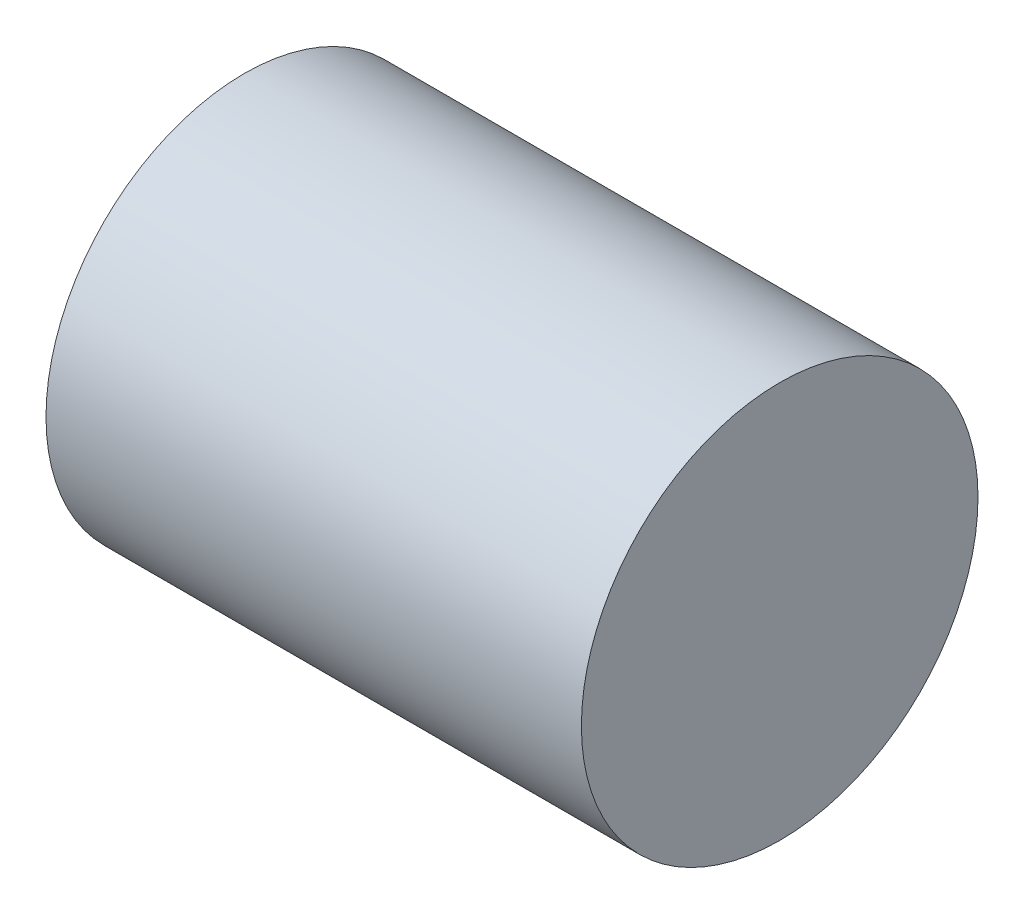
ISO-10303-21;
HEADER;
FILE_DESCRIPTION(('STEP AP214'),'2;1');
FILE_NAME('part.step','',(''),(''),'','','');
FILE_SCHEMA(('AUTOMOTIVE_DESIGN { 1 0 10303 214 1 1 1 1 }'));
ENDSEC;
DATA;
#1=APPLICATION_CONTEXT('core data for automotive mechanical design processes');
#2=APPLICATION_PROTOCOL_DEFINITION('international standard','automotive_design',2000,#1);
#3=PRODUCT_CONTEXT('',#1,'mechanical');
#4=PRODUCT('Part','Part','',(#3));
#5=PRODUCT_RELATED_PRODUCT_CATEGORY('part','',(#4));
#6=PRODUCT_DEFINITION_FORMATION('','',#4);
#7=PRODUCT_DEFINITION_CONTEXT('part definition',#1,'design');
#8=PRODUCT_DEFINITION('design','',#6,#7);
#9=PRODUCT_DEFINITION_SHAPE('','',#8);
#10=(LENGTH_UNIT() NAMED_UNIT(*) SI_UNIT(.MILLI.,.METRE.));
#11=(NAMED_UNIT(*) PLANE_ANGLE_UNIT() SI_UNIT($,.RADIAN.));
#12=(NAMED_UNIT(*) SI_UNIT($,.STERADIAN.) SOLID_ANGLE_UNIT());
#13=UNCERTAINTY_MEASURE_WITH_UNIT(LENGTH_MEASURE(1.E-05),#10,'distance_accuracy_value','');
#14=(GEOMETRIC_REPRESENTATION_CONTEXT(3) GLOBAL_UNCERTAINTY_ASSIGNED_CONTEXT((#13)) GLOBAL_UNIT_ASSIGNED_CONTEXT((#10,
#11,#12)) REPRESENTATION_CONTEXT('',''));
#15=CARTESIAN_POINT('',(0.,0.,0.));
#16=DIRECTION('',(0.,0.,1.));
#17=DIRECTION('',(1.,0.,0.));
#18=AXIS2_PLACEMENT_3D('',#15,#16,#17);
#19=CARTESIAN_POINT('',(5.4,0.,0.));
#20=DIRECTION('',(1.,0.,0.));
#21=DIRECTION('',(0.,0.,-1.));
#22=AXIS2_PLACEMENT_3D('',#19,#20,#21);
#23=PLANE('',#22);
#24=CARTESIAN_POINT('',(5.4,0.,0.));
#25=DIRECTION('',(-1.,0.,0.));
#26=DIRECTION('',(0.,0.,1.));
#27=AXIS2_PLACEMENT_3D('',#24,#25,#26);
#28=CIRCLE('',#27,4.);
#29=CARTESIAN_POINT('',(5.4,0.,4.));
#30=VERTEX_POINT('',#29);
#31=EDGE_CURVE('E9',#30,#30,#28,.T.);
#32=ORIENTED_EDGE('',*,*,#31,.F.);
#33=EDGE_LOOP('',(#32));
#34=FACE_BOUND('',#33,.T.);
#35=ADVANCED_FACE('F14',(#34),#23,.T.);
#36=CARTESIAN_POINT('',(-5.4,0.,0.));
#37=DIRECTION('',(-1.,0.,0.));
#38=DIRECTION('',(0.,0.,1.));
#39=AXIS2_PLACEMENT_3D('',#36,#37,#38);
#40=PLANE('',#39);
#41=CARTESIAN_POINT('',(-5.4,0.,0.));
#42=DIRECTION('',(1.,0.,0.));
#43=DIRECTION('',(0.,0.,-1.));
#44=AXIS2_PLACEMENT_3D('',#41,#42,#43);
#45=CIRCLE('',#44,4.);
#46=CARTESIAN_POINT('',(-5.4,0.,-4.));
#47=VERTEX_POINT('',#46);
#48=EDGE_CURVE('E21',#47,#47,#45,.T.);
#49=ORIENTED_EDGE('',*,*,#48,.F.);
#50=EDGE_LOOP('',(#49));
#51=FACE_BOUND('',#50,.T.);
#52=ADVANCED_FACE('F28',(#51),#40,.T.);
#53=CARTESIAN_POINT('',(-5.4,0.,0.));
#54=DIRECTION('',(1.,0.,0.));
#55=DIRECTION('',(0.,0.,-1.));
#56=AXIS2_PLACEMENT_3D('',#53,#54,#55);
#57=CYLINDRICAL_SURFACE('',#56,4.);
#58=ORIENTED_EDGE('',*,*,#31,.T.);
#59=EDGE_LOOP('',(#58));
#60=FACE_BOUND('',#59,.T.);
#61=ORIENTED_EDGE('',*,*,#48,.T.);
#62=EDGE_LOOP('',(#61));
#63=FACE_BOUND('',#62,.T.);
#64=ADVANCED_FACE('F16',(#60,#63),#57,.T.);
#65=CLOSED_SHELL('',(#35,#52,#64));
#66=MANIFOLD_SOLID_BREP('B1',#65);
#67=ADVANCED_BREP_SHAPE_REPRESENTATION('',(#18,#66),#14);
#68=SHAPE_DEFINITION_REPRESENTATION(#9,#67);
ENDSEC;
END-ISO-10303-21;
